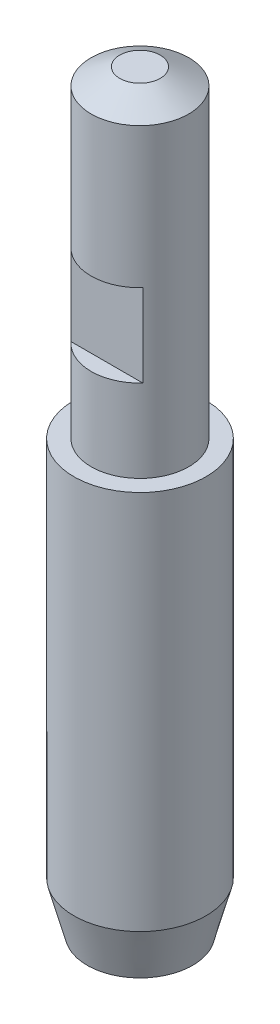
ISO-10303-21;
HEADER;
FILE_DESCRIPTION(('STEP AP214'),'2;1');
FILE_NAME('part.step','',(''),(''),'','','');
FILE_SCHEMA(('AUTOMOTIVE_DESIGN { 1 0 10303 214 1 1 1 1 }'));
ENDSEC;
DATA;
#1=APPLICATION_CONTEXT('core data for automotive mechanical design processes');
#2=APPLICATION_PROTOCOL_DEFINITION('international standard','automotive_design',2000,#1);
#3=PRODUCT_CONTEXT('',#1,'mechanical');
#4=PRODUCT('Part','Part','',(#3));
#5=PRODUCT_RELATED_PRODUCT_CATEGORY('part','',(#4));
#6=PRODUCT_DEFINITION_FORMATION('','',#4);
#7=PRODUCT_DEFINITION_CONTEXT('part definition',#1,'design');
#8=PRODUCT_DEFINITION('design','',#6,#7);
#9=PRODUCT_DEFINITION_SHAPE('','',#8);
#10=(LENGTH_UNIT() NAMED_UNIT(*) SI_UNIT(.MILLI.,.METRE.));
#11=(NAMED_UNIT(*) PLANE_ANGLE_UNIT() SI_UNIT($,.RADIAN.));
#12=(NAMED_UNIT(*) SI_UNIT($,.STERADIAN.) SOLID_ANGLE_UNIT());
#13=UNCERTAINTY_MEASURE_WITH_UNIT(LENGTH_MEASURE(1.E-05),#10,'distance_accuracy_value','');
#14=(GEOMETRIC_REPRESENTATION_CONTEXT(3) GLOBAL_UNCERTAINTY_ASSIGNED_CONTEXT((#13)) GLOBAL_UNIT_ASSIGNED_CONTEXT((#10,
#11,#12)) REPRESENTATION_CONTEXT('',''));
#15=CARTESIAN_POINT('',(0.,0.,0.));
#16=DIRECTION('',(0.,0.,1.));
#17=DIRECTION('',(1.,0.,0.));
#18=AXIS2_PLACEMENT_3D('',#15,#16,#17);
#19=CARTESIAN_POINT('',(0.,75.5253035120368,0.));
#20=DIRECTION('',(0.,1.,0.));
#21=DIRECTION('',(-1.,0.,0.));
#22=AXIS2_PLACEMENT_3D('',#19,#20,#21);
#23=PLANE('',#22);
#24=CARTESIAN_POINT('',(0.,75.5253035120368,0.));
#25=DIRECTION('',(0.,1.,0.));
#26=DIRECTION('',(-1.,0.,0.));
#27=AXIS2_PLACEMENT_3D('',#24,#25,#26);
#28=CIRCLE('',#27,1.22389565521861);
#29=CARTESIAN_POINT('',(-1.22389565521862,75.5253035120368,0.));
#30=VERTEX_POINT('',#29);
#31=EDGE_CURVE('E95',#30,#30,#28,.T.);
#32=ORIENTED_EDGE('',*,*,#31,.T.);
#33=EDGE_LOOP('',(#32));
#34=FACE_BOUND('',#33,.T.);
#35=ADVANCED_FACE('F32',(#34),#23,.T.);
#36=CARTESIAN_POINT('',(0.,75.5253035120368,0.));
#37=DIRECTION('',(0.,-1.,0.));
#38=DIRECTION('',(1.,0.,0.));
#39=AXIS2_PLACEMENT_3D('',#36,#37,#38);
#40=CONICAL_SURFACE('',#39,1.22389565521861,1.0471975511966);
#41=CARTESIAN_POINT('',(0.,74.5253035120368,0.));
#42=DIRECTION('',(0.,1.,0.));
#43=DIRECTION('',(-1.,0.,0.));
#44=AXIS2_PLACEMENT_3D('',#41,#42,#43);
#45=CIRCLE('',#44,2.95594646278748);
#46=CARTESIAN_POINT('',(-2.95594646278749,74.5253035120368,0.));
#47=VERTEX_POINT('',#46);
#48=EDGE_CURVE('E98',#47,#47,#45,.T.);
#49=ORIENTED_EDGE('',*,*,#48,.T.);
#50=EDGE_LOOP('',(#49));
#51=FACE_BOUND('',#50,.T.);
#52=ORIENTED_EDGE('',*,*,#31,.F.);
#53=EDGE_LOOP('',(#52));
#54=FACE_BOUND('',#53,.T.);
#55=ADVANCED_FACE('F136',(#51,#54),#40,.T.);
#56=CARTESIAN_POINT('',(0.,77.0951836190621,0.));
#57=DIRECTION('',(0.,1.,0.));
#58=DIRECTION('',(-1.,0.,0.));
#59=AXIS2_PLACEMENT_3D('',#56,#57,#58);
#60=CYLINDRICAL_SURFACE('',#59,2.95594646278749);
#61=CARTESIAN_POINT('',(0.,61.0253035120368,0.));
#62=DIRECTION('',(0.,-1.,0.));
#63=DIRECTION('',(0.,0.,-1.));
#64=AXIS2_PLACEMENT_3D('',#61,#62,#63);
#65=CIRCLE('',#64,2.95594646278749);
#66=CARTESIAN_POINT('',(2.1766073350207,61.0253035120368,-1.99999999999997));
#67=VERTEX_POINT('',#66);
#68=CARTESIAN_POINT('',(-2.17660733502068,61.0253035120368,-2.00000000000003));
#69=VERTEX_POINT('',#68);
#70=EDGE_CURVE('E11',#67,#69,#65,.F.);
#71=ORIENTED_EDGE('',*,*,#70,.F.);
#72=DIRECTION('',(0.,1.,0.));
#73=VECTOR('',#72,1.);
#74=CARTESIAN_POINT('',(2.17660733502069,77.0951836190621,-2.));
#75=LINE('',#74,#73);
#76=CARTESIAN_POINT('',(2.17660733502071,66.0253035120368,-2.));
#77=VERTEX_POINT('',#76);
#78=EDGE_CURVE('E39',#77,#67,#75,.F.);
#79=ORIENTED_EDGE('',*,*,#78,.F.);
#80=CARTESIAN_POINT('',(0.,66.0253035120368,0.));
#81=DIRECTION('',(0.,1.,0.));
#82=DIRECTION('',(0.,0.,1.));
#83=AXIS2_PLACEMENT_3D('',#80,#81,#82);
#84=CIRCLE('',#83,2.95594646278749);
#85=CARTESIAN_POINT('',(-2.17660733502069,66.0253035120368,-2.00000000000003));
#86=VERTEX_POINT('',#85);
#87=EDGE_CURVE('E69',#86,#77,#84,.F.);
#88=ORIENTED_EDGE('',*,*,#87,.F.);
#89=DIRECTION('',(0.,1.,0.));
#90=VECTOR('',#89,1.);
#91=CARTESIAN_POINT('',(-2.17660733502071,77.0951836190621,-2.00000000000003));
#92=LINE('',#91,#90);
#93=EDGE_CURVE('E74',#69,#86,#92,.T.);
#94=ORIENTED_EDGE('',*,*,#93,.F.);
#95=EDGE_LOOP('',(#71,#79,#88,#94));
#96=FACE_BOUND('',#95,.T.);
#97=CARTESIAN_POINT('',(0.,66.0253035120368,0.));
#98=DIRECTION('',(0.,1.,0.));
#99=DIRECTION('',(0.,0.,1.));
#100=AXIS2_PLACEMENT_3D('',#97,#98,#99);
#101=CIRCLE('',#100,2.95594646278749);
#102=CARTESIAN_POINT('',(2.1766073350207,66.0253035120368,2.));
#103=VERTEX_POINT('',#102);
#104=CARTESIAN_POINT('',(-2.17660733502069,66.0253035120368,1.99999999999997));
#105=VERTEX_POINT('',#104);
#106=EDGE_CURVE('E75',#103,#105,#101,.F.);
#107=ORIENTED_EDGE('',*,*,#106,.F.);
#108=DIRECTION('',(0.,1.,0.));
#109=VECTOR('',#108,1.);
#110=CARTESIAN_POINT('',(2.17660733502069,77.0951836190621,2.));
#111=LINE('',#110,#109);
#112=CARTESIAN_POINT('',(2.17660733502071,61.0253035120368,2.));
#113=VERTEX_POINT('',#112);
#114=EDGE_CURVE('E91',#113,#103,#111,.T.);
#115=ORIENTED_EDGE('',*,*,#114,.F.);
#116=CARTESIAN_POINT('',(0.,61.0253035120368,0.));
#117=DIRECTION('',(0.,-1.,0.));
#118=DIRECTION('',(0.,0.,-1.));
#119=AXIS2_PLACEMENT_3D('',#116,#117,#118);
#120=CIRCLE('',#119,2.95594646278749);
#121=CARTESIAN_POINT('',(-2.17660733502068,61.0253035120368,1.99999999999997));
#122=VERTEX_POINT('',#121);
#123=EDGE_CURVE('E93',#122,#113,#120,.F.);
#124=ORIENTED_EDGE('',*,*,#123,.F.);
#125=DIRECTION('',(0.,1.,0.));
#126=VECTOR('',#125,1.);
#127=CARTESIAN_POINT('',(-2.1766073350207,77.0951836190621,1.99999999999997));
#128=LINE('',#127,#126);
#129=EDGE_CURVE('E89',#105,#122,#128,.F.);
#130=ORIENTED_EDGE('',*,*,#129,.F.);
#131=EDGE_LOOP('',(#107,#115,#124,#130));
#132=FACE_BOUND('',#131,.T.);
#133=CARTESIAN_POINT('',(0.,56.0253035120368,0.));
#134=DIRECTION('',(0.,1.,0.));
#135=DIRECTION('',(-1.,0.,0.));
#136=AXIS2_PLACEMENT_3D('',#133,#134,#135);
#137=CIRCLE('',#136,2.95594646278751);
#138=CARTESIAN_POINT('',(-2.95594646278749,56.0253035120368,0.));
#139=VERTEX_POINT('',#138);
#140=EDGE_CURVE('E101',#139,#139,#137,.T.);
#141=ORIENTED_EDGE('',*,*,#140,.T.);
#142=EDGE_LOOP('',(#141));
#143=FACE_BOUND('',#142,.T.);
#144=ORIENTED_EDGE('',*,*,#48,.F.);
#145=EDGE_LOOP('',(#144));
#146=FACE_BOUND('',#145,.T.);
#147=ADVANCED_FACE('F84',(#96,#132,#143,#146),#60,.T.);
#148=CARTESIAN_POINT('',(-4.,56.0253035120368,0.));
#149=DIRECTION('',(0.,1.,0.));
#150=DIRECTION('',(-1.,0.,0.));
#151=AXIS2_PLACEMENT_3D('',#148,#149,#150);
#152=PLANE('',#151);
#153=CARTESIAN_POINT('',(0.,56.0253035120368,0.));
#154=DIRECTION('',(0.,1.,0.));
#155=DIRECTION('',(-1.,0.,0.));
#156=AXIS2_PLACEMENT_3D('',#153,#154,#155);
#157=CIRCLE('',#156,4.00000000000002);
#158=CARTESIAN_POINT('',(-4.00000000000001,56.0253035120368,0.));
#159=VERTEX_POINT('',#158);
#160=EDGE_CURVE('E104',#159,#159,#157,.T.);
#161=ORIENTED_EDGE('',*,*,#160,.T.);
#162=EDGE_LOOP('',(#161));
#163=FACE_BOUND('',#162,.T.);
#164=ORIENTED_EDGE('',*,*,#140,.F.);
#165=EDGE_LOOP('',(#164));
#166=FACE_BOUND('',#165,.T.);
#167=ADVANCED_FACE('F147',(#163,#166),#152,.T.);
#168=CARTESIAN_POINT('',(0.,77.0951836190621,0.));
#169=DIRECTION('',(0.,1.,0.));
#170=DIRECTION('',(-1.,0.,0.));
#171=AXIS2_PLACEMENT_3D('',#168,#169,#170);
#172=CYLINDRICAL_SURFACE('',#171,4.00000000000004);
#173=CARTESIAN_POINT('',(0.,33.,0.));
#174=DIRECTION('',(0.,1.,0.));
#175=DIRECTION('',(-1.,0.,0.));
#176=AXIS2_PLACEMENT_3D('',#173,#174,#175);
#177=CIRCLE('',#176,4.00000000000005);
#178=CARTESIAN_POINT('',(-3.99999999999999,33.,0.));
#179=VERTEX_POINT('',#178);
#180=EDGE_CURVE('E107',#179,#179,#177,.T.);
#181=ORIENTED_EDGE('',*,*,#180,.T.);
#182=EDGE_LOOP('',(#181));
#183=FACE_BOUND('',#182,.T.);
#184=ORIENTED_EDGE('',*,*,#160,.F.);
#185=EDGE_LOOP('',(#184));
#186=FACE_BOUND('',#185,.T.);
#187=ADVANCED_FACE('F152',(#183,#186),#172,.T.);
#188=CARTESIAN_POINT('',(0.,33.,0.));
#189=DIRECTION('',(0.,1.,0.));
#190=DIRECTION('',(-1.,0.,0.));
#191=AXIS2_PLACEMENT_3D('',#188,#189,#190);
#192=CONICAL_SURFACE('',#191,4.00000000000005,0.261799387799149);
#193=CARTESIAN_POINT('',(0.,30.,0.));
#194=DIRECTION('',(0.,1.,0.));
#195=DIRECTION('',(-1.,0.,0.));
#196=AXIS2_PLACEMENT_3D('',#193,#194,#195);
#197=CIRCLE('',#196,3.19615242270668);
#198=CARTESIAN_POINT('',(-3.19615242270662,30.,0.));
#199=VERTEX_POINT('',#198);
#200=EDGE_CURVE('E110',#199,#199,#197,.T.);
#201=ORIENTED_EDGE('',*,*,#200,.T.);
#202=EDGE_LOOP('',(#201));
#203=FACE_BOUND('',#202,.T.);
#204=ORIENTED_EDGE('',*,*,#180,.F.);
#205=EDGE_LOOP('',(#204));
#206=FACE_BOUND('',#205,.T.);
#207=ADVANCED_FACE('F156',(#203,#206),#192,.T.);
#208=CARTESIAN_POINT('',(0.,30.,0.));
#209=DIRECTION('',(0.,-1.,0.));
#210=DIRECTION('',(1.,0.,0.));
#211=AXIS2_PLACEMENT_3D('',#208,#209,#210);
#212=PLANE('',#211);
#213=CARTESIAN_POINT('',(0.,30.,0.));
#214=DIRECTION('',(0.,-1.,0.));
#215=DIRECTION('',(0.,0.,-1.));
#216=AXIS2_PLACEMENT_3D('',#213,#214,#215);
#217=CIRCLE('',#216,1.59999999999996);
#218=CARTESIAN_POINT('',(0.,30.,-1.59999999999996));
#219=VERTEX_POINT('',#218);
#220=EDGE_CURVE('E116',#219,#219,#217,.T.);
#221=ORIENTED_EDGE('',*,*,#220,.F.);
#222=EDGE_LOOP('',(#221));
#223=FACE_BOUND('',#222,.T.);
#224=ORIENTED_EDGE('',*,*,#200,.F.);
#225=EDGE_LOOP('',(#224));
#226=FACE_BOUND('',#225,.T.);
#227=ADVANCED_FACE('F160',(#223,#226),#212,.T.);
#228=CARTESIAN_POINT('',(0.,40.,0.));
#229=DIRECTION('',(0.,-1.,0.));
#230=DIRECTION('',(0.,0.,-1.));
#231=AXIS2_PLACEMENT_3D('',#228,#229,#230);
#232=CYLINDRICAL_SURFACE('',#231,1.59999999999996);
#233=CARTESIAN_POINT('',(0.,40.,0.));
#234=DIRECTION('',(0.,-1.,0.));
#235=DIRECTION('',(0.,0.,-1.));
#236=AXIS2_PLACEMENT_3D('',#233,#234,#235);
#237=CIRCLE('',#236,1.59999999999996);
#238=CARTESIAN_POINT('',(0.,40.,-1.59999999999999));
#239=VERTEX_POINT('',#238);
#240=EDGE_CURVE('E113',#239,#239,#237,.T.);
#241=ORIENTED_EDGE('',*,*,#240,.F.);
#242=EDGE_LOOP('',(#241));
#243=FACE_BOUND('',#242,.T.);
#244=ORIENTED_EDGE('',*,*,#220,.T.);
#245=EDGE_LOOP('',(#244));
#246=FACE_BOUND('',#245,.T.);
#247=ADVANCED_FACE('F164',(#243,#246),#232,.F.);
#248=CARTESIAN_POINT('',(0.,40.,0.));
#249=DIRECTION('',(0.,-1.,0.));
#250=DIRECTION('',(0.,0.,-1.));
#251=AXIS2_PLACEMENT_3D('',#248,#249,#250);
#252=PLANE('',#251);
#253=ORIENTED_EDGE('',*,*,#240,.T.);
#254=EDGE_LOOP('',(#253));
#255=FACE_BOUND('',#254,.T.);
#256=ADVANCED_FACE('F168',(#255),#252,.T.);
#257=CARTESIAN_POINT('',(-5.,66.0253035120368,4.23227980140875));
#258=DIRECTION('',(0.,1.,0.));
#259=DIRECTION('',(0.,0.,1.));
#260=AXIS2_PLACEMENT_3D('',#257,#258,#259);
#261=PLANE('',#260);
#262=ORIENTED_EDGE('',*,*,#106,.T.);
#263=DIRECTION('',(1.,0.,0.));
#264=VECTOR('',#263,1.);
#265=CARTESIAN_POINT('',(-4.99999999999999,66.0253035120368,2.));
#266=LINE('',#265,#264);
#267=EDGE_CURVE('E119',#105,#103,#266,.T.);
#268=ORIENTED_EDGE('',*,*,#267,.T.);
#269=EDGE_LOOP('',(#262,#268));
#270=FACE_BOUND('',#269,.T.);
#271=ADVANCED_FACE('F171',(#270),#261,.F.);
#272=CARTESIAN_POINT('',(-4.99999999999999,66.0253035120368,2.));
#273=DIRECTION('',(0.,0.,-1.));
#274=DIRECTION('',(0.,1.,0.));
#275=AXIS2_PLACEMENT_3D('',#272,#273,#274);
#276=PLANE('',#275);
#277=ORIENTED_EDGE('',*,*,#129,.T.);
#278=DIRECTION('',(1.,0.,0.));
#279=VECTOR('',#278,1.);
#280=CARTESIAN_POINT('',(-5.,61.0253035120368,1.99999999999997));
#281=LINE('',#280,#279);
#282=EDGE_CURVE('E52',#122,#113,#281,.T.);
#283=ORIENTED_EDGE('',*,*,#282,.T.);
#284=ORIENTED_EDGE('',*,*,#114,.T.);
#285=ORIENTED_EDGE('',*,*,#267,.F.);
#286=EDGE_LOOP('',(#277,#283,#284,#285));
#287=FACE_BOUND('',#286,.T.);
#288=ADVANCED_FACE('F133',(#287),#276,.F.);
#289=CARTESIAN_POINT('',(-5.,61.0253035120368,4.23227980140872));
#290=DIRECTION('',(0.,-1.,0.));
#291=DIRECTION('',(0.,0.,-1.));
#292=AXIS2_PLACEMENT_3D('',#289,#290,#291);
#293=PLANE('',#292);
#294=ORIENTED_EDGE('',*,*,#123,.T.);
#295=ORIENTED_EDGE('',*,*,#282,.F.);
#296=EDGE_LOOP('',(#294,#295));
#297=FACE_BOUND('',#296,.T.);
#298=ADVANCED_FACE('F126',(#297),#293,.F.);
#299=CARTESIAN_POINT('',(-5.00000000000001,61.0253035120368,-4.23227980140875));
#300=DIRECTION('',(0.,-1.,0.));
#301=DIRECTION('',(0.,0.,-1.));
#302=AXIS2_PLACEMENT_3D('',#299,#300,#301);
#303=PLANE('',#302);
#304=ORIENTED_EDGE('',*,*,#70,.T.);
#305=DIRECTION('',(1.,0.,0.));
#306=VECTOR('',#305,1.);
#307=CARTESIAN_POINT('',(-5.00000000000001,61.0253035120368,-2.));
#308=LINE('',#307,#306);
#309=EDGE_CURVE('E81',#69,#67,#308,.T.);
#310=ORIENTED_EDGE('',*,*,#309,.T.);
#311=EDGE_LOOP('',(#304,#310));
#312=FACE_BOUND('',#311,.T.);
#313=ADVANCED_FACE('F124',(#312),#303,.F.);
#314=CARTESIAN_POINT('',(-5.,66.0253035120368,-2.));
#315=DIRECTION('',(0.,0.,1.));
#316=DIRECTION('',(0.,-1.,0.));
#317=AXIS2_PLACEMENT_3D('',#314,#315,#316);
#318=PLANE('',#317);
#319=ORIENTED_EDGE('',*,*,#78,.T.);
#320=ORIENTED_EDGE('',*,*,#309,.F.);
#321=ORIENTED_EDGE('',*,*,#93,.T.);
#322=DIRECTION('',(1.,0.,0.));
#323=VECTOR('',#322,1.);
#324=CARTESIAN_POINT('',(-5.,66.0253035120368,-2.));
#325=LINE('',#324,#323);
#326=EDGE_CURVE('E45',#86,#77,#325,.T.);
#327=ORIENTED_EDGE('',*,*,#326,.T.);
#328=EDGE_LOOP('',(#319,#320,#321,#327));
#329=FACE_BOUND('',#328,.T.);
#330=ADVANCED_FACE('F78',(#329),#318,.F.);
#331=CARTESIAN_POINT('',(-5.00000000000001,66.0253035120368,-4.23227980140872));
#332=DIRECTION('',(0.,1.,0.));
#333=DIRECTION('',(0.,0.,1.));
#334=AXIS2_PLACEMENT_3D('',#331,#332,#333);
#335=PLANE('',#334);
#336=ORIENTED_EDGE('',*,*,#87,.T.);
#337=ORIENTED_EDGE('',*,*,#326,.F.);
#338=EDGE_LOOP('',(#336,#337));
#339=FACE_BOUND('',#338,.T.);
#340=ADVANCED_FACE('F70',(#339),#335,.F.);
#341=CLOSED_SHELL('',(#35,#55,#147,#167,#187,#207,#227,#247,#256,#271,#288,#298,#313,#330,#340));
#342=MANIFOLD_SOLID_BREP('B2',#341);
#343=ADVANCED_BREP_SHAPE_REPRESENTATION('',(#18,#342),#14);
#344=SHAPE_DEFINITION_REPRESENTATION(#9,#343);
ENDSEC;
END-ISO-10303-21;
